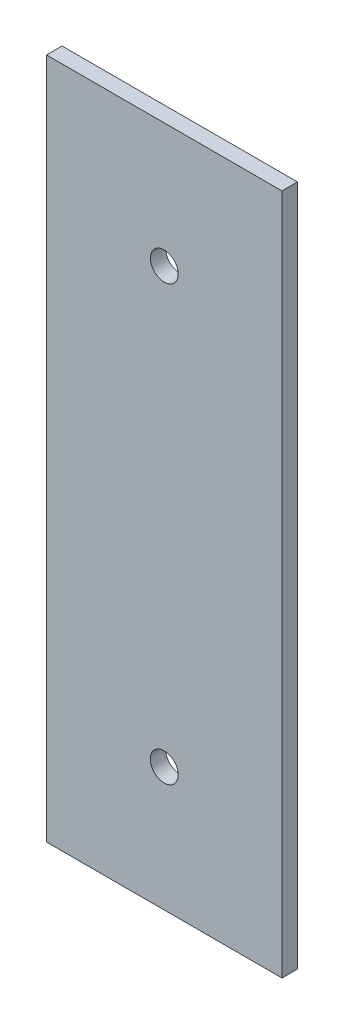
ISO-10303-21;
HEADER;
FILE_DESCRIPTION(('STEP AP214'),'2;1');
FILE_NAME('part.step','',(''),(''),'','','');
FILE_SCHEMA(('AUTOMOTIVE_DESIGN { 1 0 10303 214 1 1 1 1 }'));
ENDSEC;
DATA;
#1=APPLICATION_CONTEXT('core data for automotive mechanical design processes');
#2=APPLICATION_PROTOCOL_DEFINITION('international standard','automotive_design',2000,#1);
#3=PRODUCT_CONTEXT('',#1,'mechanical');
#4=PRODUCT('Part','Part','',(#3));
#5=PRODUCT_RELATED_PRODUCT_CATEGORY('part','',(#4));
#6=PRODUCT_DEFINITION_FORMATION('','',#4);
#7=PRODUCT_DEFINITION_CONTEXT('part definition',#1,'design');
#8=PRODUCT_DEFINITION('design','',#6,#7);
#9=PRODUCT_DEFINITION_SHAPE('','',#8);
#10=(LENGTH_UNIT() NAMED_UNIT(*) SI_UNIT(.MILLI.,.METRE.));
#11=(NAMED_UNIT(*) PLANE_ANGLE_UNIT() SI_UNIT($,.RADIAN.));
#12=(NAMED_UNIT(*) SI_UNIT($,.STERADIAN.) SOLID_ANGLE_UNIT());
#13=UNCERTAINTY_MEASURE_WITH_UNIT(LENGTH_MEASURE(1.E-05),#10,'distance_accuracy_value','');
#14=(GEOMETRIC_REPRESENTATION_CONTEXT(3) GLOBAL_UNCERTAINTY_ASSIGNED_CONTEXT((#13)) GLOBAL_UNIT_ASSIGNED_CONTEXT((#10,
#11,#12)) REPRESENTATION_CONTEXT('',''));
#15=CARTESIAN_POINT('',(0.,0.,0.));
#16=DIRECTION('',(0.,0.,1.));
#17=DIRECTION('',(1.,0.,0.));
#18=AXIS2_PLACEMENT_3D('',#15,#16,#17);
#19=CARTESIAN_POINT('',(19.,55.,2.5));
#20=DIRECTION('',(-1.,0.,0.));
#21=DIRECTION('',(0.,-1.,0.));
#22=AXIS2_PLACEMENT_3D('',#19,#20,#21);
#23=PLANE('',#22);
#24=DIRECTION('',(0.,1.,0.));
#25=VECTOR('',#24,1.);
#26=CARTESIAN_POINT('',(19.,55.,0.));
#27=LINE('',#26,#25);
#28=CARTESIAN_POINT('',(19.,-55.,0.));
#29=VERTEX_POINT('',#28);
#30=CARTESIAN_POINT('',(19.,55.,0.));
#31=VERTEX_POINT('',#30);
#32=EDGE_CURVE('E117',#29,#31,#27,.T.);
#33=ORIENTED_EDGE('',*,*,#32,.T.);
#34=DIRECTION('',(0.,0.,-1.));
#35=VECTOR('',#34,1.);
#36=CARTESIAN_POINT('',(19.,55.,2.5));
#37=LINE('',#36,#35);
#38=CARTESIAN_POINT('',(19.,55.,2.5));
#39=VERTEX_POINT('',#38);
#40=EDGE_CURVE('E11',#39,#31,#37,.T.);
#41=ORIENTED_EDGE('',*,*,#40,.F.);
#42=DIRECTION('',(0.,1.,0.));
#43=VECTOR('',#42,1.);
#44=CARTESIAN_POINT('',(19.,55.,2.5));
#45=LINE('',#44,#43);
#46=CARTESIAN_POINT('',(19.,-55.,2.5));
#47=VERTEX_POINT('',#46);
#48=EDGE_CURVE('E101',#47,#39,#45,.T.);
#49=ORIENTED_EDGE('',*,*,#48,.F.);
#50=DIRECTION('',(0.,0.,-1.));
#51=VECTOR('',#50,1.);
#52=CARTESIAN_POINT('',(19.,-55.,2.5));
#53=LINE('',#52,#51);
#54=EDGE_CURVE('E113',#47,#29,#53,.T.);
#55=ORIENTED_EDGE('',*,*,#54,.T.);
#56=EDGE_LOOP('',(#33,#41,#49,#55));
#57=FACE_BOUND('',#56,.T.);
#58=ADVANCED_FACE('F49',(#57),#23,.F.);
#59=CARTESIAN_POINT('',(-19.,55.,2.5));
#60=DIRECTION('',(0.,-1.,0.));
#61=DIRECTION('',(0.,0.,-1.));
#62=AXIS2_PLACEMENT_3D('',#59,#60,#61);
#63=PLANE('',#62);
#64=DIRECTION('',(-1.,0.,0.));
#65=VECTOR('',#64,1.);
#66=CARTESIAN_POINT('',(-19.,55.,0.));
#67=LINE('',#66,#65);
#68=CARTESIAN_POINT('',(-19.,55.,0.));
#69=VERTEX_POINT('',#68);
#70=EDGE_CURVE('E106',#31,#69,#67,.T.);
#71=ORIENTED_EDGE('',*,*,#70,.T.);
#72=DIRECTION('',(0.,0.,-1.));
#73=VECTOR('',#72,1.);
#74=CARTESIAN_POINT('',(-19.,55.,2.5));
#75=LINE('',#74,#73);
#76=CARTESIAN_POINT('',(-19.,55.,2.5));
#77=VERTEX_POINT('',#76);
#78=EDGE_CURVE('E58',#77,#69,#75,.T.);
#79=ORIENTED_EDGE('',*,*,#78,.F.);
#80=DIRECTION('',(-1.,0.,0.));
#81=VECTOR('',#80,1.);
#82=CARTESIAN_POINT('',(-19.,55.,2.5));
#83=LINE('',#82,#81);
#84=EDGE_CURVE('E96',#39,#77,#83,.T.);
#85=ORIENTED_EDGE('',*,*,#84,.F.);
#86=ORIENTED_EDGE('',*,*,#40,.T.);
#87=EDGE_LOOP('',(#71,#79,#85,#86));
#88=FACE_BOUND('',#87,.T.);
#89=ADVANCED_FACE('F105',(#88),#63,.F.);
#90=CARTESIAN_POINT('',(-19.,55.,2.5));
#91=DIRECTION('',(1.,0.,0.));
#92=DIRECTION('',(0.,1.,0.));
#93=AXIS2_PLACEMENT_3D('',#90,#91,#92);
#94=PLANE('',#93);
#95=DIRECTION('',(0.,-1.,0.));
#96=VECTOR('',#95,1.);
#97=CARTESIAN_POINT('',(-19.,55.,0.));
#98=LINE('',#97,#96);
#99=CARTESIAN_POINT('',(-19.,-55.,0.));
#100=VERTEX_POINT('',#99);
#101=EDGE_CURVE('E83',#69,#100,#98,.T.);
#102=ORIENTED_EDGE('',*,*,#101,.T.);
#103=DIRECTION('',(0.,0.,-1.));
#104=VECTOR('',#103,1.);
#105=CARTESIAN_POINT('',(-19.,-55.,2.5));
#106=LINE('',#105,#104);
#107=CARTESIAN_POINT('',(-19.,-55.,2.5));
#108=VERTEX_POINT('',#107);
#109=EDGE_CURVE('E108',#108,#100,#106,.T.);
#110=ORIENTED_EDGE('',*,*,#109,.F.);
#111=DIRECTION('',(0.,-1.,0.));
#112=VECTOR('',#111,1.);
#113=CARTESIAN_POINT('',(-19.,55.,2.5));
#114=LINE('',#113,#112);
#115=EDGE_CURVE('E99',#77,#108,#114,.T.);
#116=ORIENTED_EDGE('',*,*,#115,.F.);
#117=ORIENTED_EDGE('',*,*,#78,.T.);
#118=EDGE_LOOP('',(#102,#110,#116,#117));
#119=FACE_BOUND('',#118,.T.);
#120=ADVANCED_FACE('F109',(#119),#94,.F.);
#121=CARTESIAN_POINT('',(-19.,-55.,2.5));
#122=DIRECTION('',(0.,1.,0.));
#123=DIRECTION('',(0.,0.,1.));
#124=AXIS2_PLACEMENT_3D('',#121,#122,#123);
#125=PLANE('',#124);
#126=DIRECTION('',(1.,0.,0.));
#127=VECTOR('',#126,1.);
#128=CARTESIAN_POINT('',(-19.,-55.,0.));
#129=LINE('',#128,#127);
#130=EDGE_CURVE('E89',#100,#29,#129,.T.);
#131=ORIENTED_EDGE('',*,*,#130,.T.);
#132=ORIENTED_EDGE('',*,*,#54,.F.);
#133=DIRECTION('',(1.,0.,0.));
#134=VECTOR('',#133,1.);
#135=CARTESIAN_POINT('',(-19.,-55.,2.5));
#136=LINE('',#135,#134);
#137=EDGE_CURVE('E66',#108,#47,#136,.T.);
#138=ORIENTED_EDGE('',*,*,#137,.F.);
#139=ORIENTED_EDGE('',*,*,#109,.T.);
#140=EDGE_LOOP('',(#131,#132,#138,#139));
#141=FACE_BOUND('',#140,.T.);
#142=ADVANCED_FACE('F131',(#141),#125,.F.);
#143=CARTESIAN_POINT('',(0.,0.,2.5));
#144=DIRECTION('',(0.,0.,1.));
#145=DIRECTION('',(1.,0.,0.));
#146=AXIS2_PLACEMENT_3D('',#143,#144,#145);
#147=PLANE('',#146);
#148=CARTESIAN_POINT('',(0.,35.,2.5));
#149=DIRECTION('',(0.,0.,1.));
#150=DIRECTION('',(1.,0.,0.));
#151=AXIS2_PLACEMENT_3D('',#148,#149,#150);
#152=CIRCLE('',#151,2.25);
#153=CARTESIAN_POINT('',(2.25,35.,2.5));
#154=VERTEX_POINT('',#153);
#155=EDGE_CURVE('E121',#154,#154,#152,.T.);
#156=ORIENTED_EDGE('',*,*,#155,.F.);
#157=EDGE_LOOP('',(#156));
#158=FACE_BOUND('',#157,.T.);
#159=CARTESIAN_POINT('',(0.,-35.,2.5));
#160=DIRECTION('',(0.,0.,1.));
#161=DIRECTION('',(1.,0.,0.));
#162=AXIS2_PLACEMENT_3D('',#159,#160,#161);
#163=CIRCLE('',#162,2.25);
#164=CARTESIAN_POINT('',(2.25,-35.,2.5));
#165=VERTEX_POINT('',#164);
#166=EDGE_CURVE('E141',#165,#165,#163,.T.);
#167=ORIENTED_EDGE('',*,*,#166,.F.);
#168=EDGE_LOOP('',(#167));
#169=FACE_BOUND('',#168,.T.);
#170=ORIENTED_EDGE('',*,*,#48,.T.);
#171=ORIENTED_EDGE('',*,*,#84,.T.);
#172=ORIENTED_EDGE('',*,*,#115,.T.);
#173=ORIENTED_EDGE('',*,*,#137,.T.);
#174=EDGE_LOOP('',(#170,#171,#172,#173));
#175=FACE_BOUND('',#174,.T.);
#176=ADVANCED_FACE('F97',(#158,#169,#175),#147,.T.);
#177=CARTESIAN_POINT('',(0.,0.,0.));
#178=DIRECTION('',(0.,0.,1.));
#179=DIRECTION('',(1.,0.,0.));
#180=AXIS2_PLACEMENT_3D('',#177,#178,#179);
#181=PLANE('',#180);
#182=CARTESIAN_POINT('',(0.,35.,0.));
#183=DIRECTION('',(0.,0.,1.));
#184=DIRECTION('',(1.,0.,0.));
#185=AXIS2_PLACEMENT_3D('',#182,#183,#184);
#186=CIRCLE('',#185,2.25);
#187=CARTESIAN_POINT('',(2.25,35.,0.));
#188=VERTEX_POINT('',#187);
#189=EDGE_CURVE('E145',#188,#188,#186,.T.);
#190=ORIENTED_EDGE('',*,*,#189,.T.);
#191=EDGE_LOOP('',(#190));
#192=FACE_BOUND('',#191,.T.);
#193=CARTESIAN_POINT('',(0.,-35.,0.));
#194=DIRECTION('',(0.,0.,1.));
#195=DIRECTION('',(-1.,0.,0.));
#196=AXIS2_PLACEMENT_3D('',#193,#194,#195);
#197=CIRCLE('',#196,2.25);
#198=CARTESIAN_POINT('',(-2.25,-35.,0.));
#199=VERTEX_POINT('',#198);
#200=EDGE_CURVE('E146',#199,#199,#197,.T.);
#201=ORIENTED_EDGE('',*,*,#200,.T.);
#202=EDGE_LOOP('',(#201));
#203=FACE_BOUND('',#202,.T.);
#204=ORIENTED_EDGE('',*,*,#32,.F.);
#205=ORIENTED_EDGE('',*,*,#130,.F.);
#206=ORIENTED_EDGE('',*,*,#101,.F.);
#207=ORIENTED_EDGE('',*,*,#70,.F.);
#208=EDGE_LOOP('',(#204,#205,#206,#207));
#209=FACE_BOUND('',#208,.T.);
#210=ADVANCED_FACE('F134',(#192,#203,#209),#181,.F.);
#211=CARTESIAN_POINT('',(0.,-35.,0.));
#212=DIRECTION('',(0.,0.,1.));
#213=DIRECTION('',(1.,0.,0.));
#214=AXIS2_PLACEMENT_3D('',#211,#212,#213);
#215=CYLINDRICAL_SURFACE('',#214,2.25);
#216=ORIENTED_EDGE('',*,*,#166,.T.);
#217=EDGE_LOOP('',(#216));
#218=FACE_BOUND('',#217,.T.);
#219=ORIENTED_EDGE('',*,*,#200,.F.);
#220=EDGE_LOOP('',(#219));
#221=FACE_BOUND('',#220,.T.);
#222=ADVANCED_FACE('F158',(#218,#221),#215,.F.);
#223=CARTESIAN_POINT('',(0.,35.,0.));
#224=DIRECTION('',(0.,0.,1.));
#225=DIRECTION('',(1.,0.,0.));
#226=AXIS2_PLACEMENT_3D('',#223,#224,#225);
#227=CYLINDRICAL_SURFACE('',#226,2.25);
#228=ORIENTED_EDGE('',*,*,#155,.T.);
#229=EDGE_LOOP('',(#228));
#230=FACE_BOUND('',#229,.T.);
#231=ORIENTED_EDGE('',*,*,#189,.F.);
#232=EDGE_LOOP('',(#231));
#233=FACE_BOUND('',#232,.T.);
#234=ADVANCED_FACE('F156',(#230,#233),#227,.F.);
#235=CLOSED_SHELL('',(#58,#89,#120,#142,#176,#210,#222,#234));
#236=MANIFOLD_SOLID_BREP('B2',#235);
#237=ADVANCED_BREP_SHAPE_REPRESENTATION('',(#18,#236),#14);
#238=SHAPE_DEFINITION_REPRESENTATION(#9,#237);
ENDSEC;
END-ISO-10303-21;
